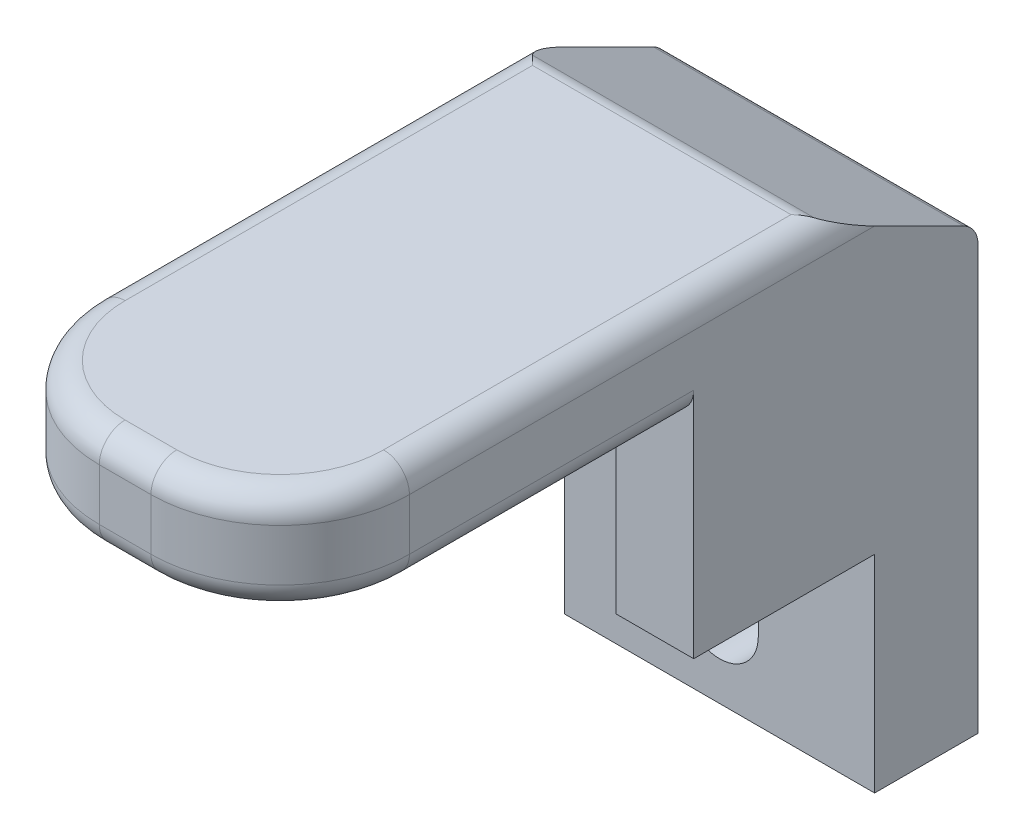
ISO-10303-21;
HEADER;
FILE_DESCRIPTION(('STEP AP214'),'2;1');
FILE_NAME('part.step','',(''),(''),'','','');
FILE_SCHEMA(('AUTOMOTIVE_DESIGN { 1 0 10303 214 1 1 1 1 }'));
ENDSEC;
DATA;
#1=APPLICATION_CONTEXT('core data for automotive mechanical design processes');
#2=APPLICATION_PROTOCOL_DEFINITION('international standard','automotive_design',2000,#1);
#3=PRODUCT_CONTEXT('',#1,'mechanical');
#4=PRODUCT('Part','Part','',(#3));
#5=PRODUCT_RELATED_PRODUCT_CATEGORY('part','',(#4));
#6=PRODUCT_DEFINITION_FORMATION('','',#4);
#7=PRODUCT_DEFINITION_CONTEXT('part definition',#1,'design');
#8=PRODUCT_DEFINITION('design','',#6,#7);
#9=PRODUCT_DEFINITION_SHAPE('','',#8);
#10=(LENGTH_UNIT() NAMED_UNIT(*) SI_UNIT(.MILLI.,.METRE.));
#11=(NAMED_UNIT(*) PLANE_ANGLE_UNIT() SI_UNIT($,.RADIAN.));
#12=(NAMED_UNIT(*) SI_UNIT($,.STERADIAN.) SOLID_ANGLE_UNIT());
#13=UNCERTAINTY_MEASURE_WITH_UNIT(LENGTH_MEASURE(1.E-05),#10,'distance_accuracy_value','');
#14=(GEOMETRIC_REPRESENTATION_CONTEXT(3) GLOBAL_UNCERTAINTY_ASSIGNED_CONTEXT((#13)) GLOBAL_UNIT_ASSIGNED_CONTEXT((#10,
#11,#12)) REPRESENTATION_CONTEXT('',''));
#15=CARTESIAN_POINT('',(0.,0.,0.));
#16=DIRECTION('',(0.,0.,1.));
#17=DIRECTION('',(1.,0.,0.));
#18=AXIS2_PLACEMENT_3D('',#15,#16,#17);
#19=CARTESIAN_POINT('',(0.,0.,4.));
#20=DIRECTION('',(0.,0.,1.));
#21=DIRECTION('',(1.,0.,0.));
#22=AXIS2_PLACEMENT_3D('',#19,#20,#21);
#23=PLANE('',#22);
#24=DIRECTION('',(-1.,0.,0.));
#25=VECTOR('',#24,1.);
#26=CARTESIAN_POINT('',(5.94978636769456,6.49974785183342,4.));
#27=LINE('',#26,#25);
#28=CARTESIAN_POINT('',(8.94978636769456,6.49974785183342,4.));
#29=VERTEX_POINT('',#28);
#30=CARTESIAN_POINT('',(5.94978636769456,6.49974785183342,4.));
#31=VERTEX_POINT('',#30);
#32=EDGE_CURVE('E309',#29,#31,#27,.T.);
#33=ORIENTED_EDGE('',*,*,#32,.F.);
#34=DIRECTION('',(0.,1.,0.));
#35=VECTOR('',#34,1.);
#36=CARTESIAN_POINT('',(8.94978636769456,6.49974785183342,4.));
#37=LINE('',#36,#35);
#38=CARTESIAN_POINT('',(8.94978636769456,2.99974785183342,4.));
#39=VERTEX_POINT('',#38);
#40=EDGE_CURVE('E307',#39,#29,#37,.T.);
#41=ORIENTED_EDGE('',*,*,#40,.F.);
#42=CARTESIAN_POINT('',(7.44978636769456,2.99974785183342,4.));
#43=DIRECTION('',(0.,0.,1.));
#44=DIRECTION('',(1.,0.,0.));
#45=AXIS2_PLACEMENT_3D('',#42,#43,#44);
#46=CIRCLE('',#45,1.5);
#47=CARTESIAN_POINT('',(5.94978636769456,2.99974785183342,4.));
#48=VERTEX_POINT('',#47);
#49=EDGE_CURVE('E315',#48,#39,#46,.T.);
#50=ORIENTED_EDGE('',*,*,#49,.F.);
#51=DIRECTION('',(0.,-1.,0.));
#52=VECTOR('',#51,1.);
#53=CARTESIAN_POINT('',(5.94978636769456,6.49974785183342,4.));
#54=LINE('',#53,#52);
#55=EDGE_CURVE('E312',#31,#48,#54,.T.);
#56=ORIENTED_EDGE('',*,*,#55,.F.);
#57=EDGE_LOOP('',(#33,#41,#50,#56));
#58=FACE_BOUND('',#57,.T.);
#59=DIRECTION('',(1.,0.,0.));
#60=VECTOR('',#59,1.);
#61=CARTESIAN_POINT('',(10.4497863676946,7.99974785183342,4.));
#62=LINE('',#61,#60);
#63=CARTESIAN_POINT('',(10.4497863676946,7.99974785183342,4.));
#64=VERTEX_POINT('',#63);
#65=CARTESIAN_POINT('',(13.4497863676946,7.99974785183342,4.));
#66=VERTEX_POINT('',#65);
#67=EDGE_CURVE('E264',#64,#66,#62,.T.);
#68=ORIENTED_EDGE('',*,*,#67,.F.);
#69=DIRECTION('',(0.,-1.,0.));
#70=VECTOR('',#69,1.);
#71=CARTESIAN_POINT('',(10.4497863676946,15.9997478518334,4.));
#72=LINE('',#71,#70);
#73=CARTESIAN_POINT('',(10.4497863676946,15.9997478518334,4.));
#74=VERTEX_POINT('',#73);
#75=EDGE_CURVE('E267',#74,#64,#72,.T.);
#76=ORIENTED_EDGE('',*,*,#75,.F.);
#77=DIRECTION('',(1.,0.,0.));
#78=VECTOR('',#77,1.);
#79=CARTESIAN_POINT('',(0.,15.9997478518334,4.));
#80=LINE('',#79,#78);
#81=CARTESIAN_POINT('',(8.94978636769456,15.9997478518334,4.));
#82=VERTEX_POINT('',#81);
#83=EDGE_CURVE('E301',#82,#74,#80,.T.);
#84=ORIENTED_EDGE('',*,*,#83,.F.);
#85=DIRECTION('',(0.,1.,0.));
#86=VECTOR('',#85,1.);
#87=CARTESIAN_POINT('',(8.94978636769456,16.9997478518334,4.));
#88=LINE('',#87,#86);
#89=CARTESIAN_POINT('',(8.94978636769456,11.9997478518334,4.));
#90=VERTEX_POINT('',#89);
#91=EDGE_CURVE('E344',#90,#82,#88,.T.);
#92=ORIENTED_EDGE('',*,*,#91,.F.);
#93=DIRECTION('',(1.,0.,0.));
#94=VECTOR('',#93,1.);
#95=CARTESIAN_POINT('',(5.94978636769456,11.9997478518334,4.));
#96=LINE('',#95,#94);
#97=CARTESIAN_POINT('',(5.94978636769456,11.9997478518334,4.));
#98=VERTEX_POINT('',#97);
#99=EDGE_CURVE('E341',#98,#90,#96,.T.);
#100=ORIENTED_EDGE('',*,*,#99,.F.);
#101=DIRECTION('',(0.,-1.,0.));
#102=VECTOR('',#101,1.);
#103=CARTESIAN_POINT('',(5.94978636769456,16.9997478518334,4.));
#104=LINE('',#103,#102);
#105=CARTESIAN_POINT('',(5.94978636769456,15.9997478518334,4.));
#106=VERTEX_POINT('',#105);
#107=EDGE_CURVE('E339',#106,#98,#104,.T.);
#108=ORIENTED_EDGE('',*,*,#107,.F.);
#109=CARTESIAN_POINT('',(4.44978636769456,15.9997478518334,4.));
#110=VERTEX_POINT('',#109);
#111=EDGE_CURVE('E305',#110,#106,#80,.T.);
#112=ORIENTED_EDGE('',*,*,#111,.F.);
#113=DIRECTION('',(0.,1.,0.));
#114=VECTOR('',#113,1.);
#115=CARTESIAN_POINT('',(4.44978636769456,15.9997478518334,4.));
#116=LINE('',#115,#114);
#117=CARTESIAN_POINT('',(4.44978636769456,7.99974785183342,4.));
#118=VERTEX_POINT('',#117);
#119=EDGE_CURVE('E271',#118,#110,#116,.T.);
#120=ORIENTED_EDGE('',*,*,#119,.F.);
#121=DIRECTION('',(1.,0.,0.));
#122=VECTOR('',#121,1.);
#123=CARTESIAN_POINT('',(1.44978636769456,7.99974785183342,4.));
#124=LINE('',#123,#122);
#125=CARTESIAN_POINT('',(1.44978636769456,7.99974785183342,4.));
#126=VERTEX_POINT('',#125);
#127=EDGE_CURVE('E268',#126,#118,#124,.T.);
#128=ORIENTED_EDGE('',*,*,#127,.F.);
#129=DIRECTION('',(0.,-1.,0.));
#130=VECTOR('',#129,1.);
#131=CARTESIAN_POINT('',(1.44978636769456,19.9997478518334,4.));
#132=LINE('',#131,#130);
#133=CARTESIAN_POINT('',(1.44978636769456,-0.000252148166584032,4.));
#134=VERTEX_POINT('',#133);
#135=EDGE_CURVE('E361',#126,#134,#132,.T.);
#136=ORIENTED_EDGE('',*,*,#135,.T.);
#137=DIRECTION('',(1.,0.,0.));
#138=VECTOR('',#137,1.);
#139=CARTESIAN_POINT('',(1.44978636769456,-0.000252148166584032,4.));
#140=LINE('',#139,#138);
#141=CARTESIAN_POINT('',(13.4497863676946,-0.000252148166584032,4.));
#142=VERTEX_POINT('',#141);
#143=EDGE_CURVE('E364',#134,#142,#140,.T.);
#144=ORIENTED_EDGE('',*,*,#143,.T.);
#145=DIRECTION('',(0.,1.,0.));
#146=VECTOR('',#145,1.);
#147=CARTESIAN_POINT('',(13.4497863676946,-0.000252148166584032,4.));
#148=LINE('',#147,#146);
#149=EDGE_CURVE('E359',#142,#66,#148,.T.);
#150=ORIENTED_EDGE('',*,*,#149,.T.);
#151=EDGE_LOOP('',(#68,#76,#84,#92,#100,#108,#112,#120,#128,#136,#144,#150));
#152=FACE_BOUND('',#151,.T.);
#153=ADVANCED_FACE('F36',(#58,#152),#23,.T.);
#154=CARTESIAN_POINT('',(1.44978636769456,15.9997478518334,-12.6491106406735));
#155=DIRECTION('',(0.,-1.,0.));
#156=DIRECTION('',(0.,0.,-1.));
#157=AXIS2_PLACEMENT_3D('',#154,#155,#156);
#158=PLANE('',#157);
#159=DIRECTION('',(-1.,0.,0.));
#160=VECTOR('',#159,1.);
#161=CARTESIAN_POINT('',(10.4497863676946,15.9997478518334,11.));
#162=LINE('',#161,#160);
#163=CARTESIAN_POINT('',(12.4497863676946,15.9997478518334,11.));
#164=VERTEX_POINT('',#163);
#165=CARTESIAN_POINT('',(10.4497863676946,15.9997478518334,11.));
#166=VERTEX_POINT('',#165);
#167=EDGE_CURVE('E260',#164,#166,#162,.T.);
#168=ORIENTED_EDGE('',*,*,#167,.F.);
#169=DIRECTION('',(0.,0.,1.));
#170=VECTOR('',#169,1.);
#171=CARTESIAN_POINT('',(12.4497863676946,15.9997478518334,22.));
#172=LINE('',#171,#170);
#173=CARTESIAN_POINT('',(12.4497863676946,15.9997478518334,22.));
#174=VERTEX_POINT('',#173);
#175=EDGE_CURVE('E442',#164,#174,#172,.T.);
#176=ORIENTED_EDGE('',*,*,#175,.T.);
#177=CARTESIAN_POINT('',(8.44978636769456,15.9997478518334,22.));
#178=DIRECTION('',(0.,-1.,0.));
#179=DIRECTION('',(0.,0.,-1.));
#180=AXIS2_PLACEMENT_3D('',#177,#178,#179);
#181=CIRCLE('',#180,4.);
#182=CARTESIAN_POINT('',(8.44978636769456,15.9997478518334,26.));
#183=VERTEX_POINT('',#182);
#184=EDGE_CURVE('E60',#174,#183,#181,.T.);
#185=ORIENTED_EDGE('',*,*,#184,.T.);
#186=DIRECTION('',(1.,0.,0.));
#187=VECTOR('',#186,1.);
#188=CARTESIAN_POINT('',(1.44978636769456,15.9997478518334,26.));
#189=LINE('',#188,#187);
#190=CARTESIAN_POINT('',(6.44978636769456,15.9997478518334,26.));
#191=VERTEX_POINT('',#190);
#192=EDGE_CURVE('E439',#183,#191,#189,.F.);
#193=ORIENTED_EDGE('',*,*,#192,.T.);
#194=CARTESIAN_POINT('',(6.44978636769456,15.9997478518334,22.));
#195=DIRECTION('',(0.,-1.,0.));
#196=DIRECTION('',(0.,0.,-1.));
#197=AXIS2_PLACEMENT_3D('',#194,#195,#196);
#198=CIRCLE('',#197,4.);
#199=CARTESIAN_POINT('',(2.44978636769456,15.9997478518334,22.));
#200=VERTEX_POINT('',#199);
#201=EDGE_CURVE('E435',#191,#200,#198,.T.);
#202=ORIENTED_EDGE('',*,*,#201,.T.);
#203=DIRECTION('',(0.,0.,1.));
#204=VECTOR('',#203,1.);
#205=CARTESIAN_POINT('',(2.44978636769456,15.9997478518334,11.));
#206=LINE('',#205,#204);
#207=CARTESIAN_POINT('',(2.44978636769456,15.9997478518334,11.));
#208=VERTEX_POINT('',#207);
#209=EDGE_CURVE('E437',#200,#208,#206,.F.);
#210=ORIENTED_EDGE('',*,*,#209,.T.);
#211=DIRECTION('',(-1.,0.,0.));
#212=VECTOR('',#211,1.);
#213=CARTESIAN_POINT('',(1.44978636769456,15.9997478518334,11.));
#214=LINE('',#213,#212);
#215=CARTESIAN_POINT('',(4.44978636769456,15.9997478518334,11.));
#216=VERTEX_POINT('',#215);
#217=EDGE_CURVE('E285',#216,#208,#214,.T.);
#218=ORIENTED_EDGE('',*,*,#217,.F.);
#219=DIRECTION('',(0.,0.,-1.));
#220=VECTOR('',#219,1.);
#221=CARTESIAN_POINT('',(4.44978636769456,15.9997478518334,11.));
#222=LINE('',#221,#220);
#223=EDGE_CURVE('E287',#216,#110,#222,.T.);
#224=ORIENTED_EDGE('',*,*,#223,.T.);
#225=ORIENTED_EDGE('',*,*,#111,.T.);
#226=DIRECTION('',(0.,0.,-1.));
#227=VECTOR('',#226,1.);
#228=CARTESIAN_POINT('',(5.94978636769456,15.9997478518334,4.));
#229=LINE('',#228,#227);
#230=CARTESIAN_POINT('',(5.94978636769456,15.9997478518334,0.));
#231=VERTEX_POINT('',#230);
#232=EDGE_CURVE('E304',#106,#231,#229,.T.);
#233=ORIENTED_EDGE('',*,*,#232,.T.);
#234=DIRECTION('',(-1.,0.,0.));
#235=VECTOR('',#234,1.);
#236=CARTESIAN_POINT('',(1.44978636769456,15.9997478518334,0.));
#237=LINE('',#236,#235);
#238=CARTESIAN_POINT('',(8.94978636769456,15.9997478518334,0.));
#239=VERTEX_POINT('',#238);
#240=EDGE_CURVE('E298',#239,#231,#237,.T.);
#241=ORIENTED_EDGE('',*,*,#240,.F.);
#242=DIRECTION('',(0.,0.,1.));
#243=VECTOR('',#242,1.);
#244=CARTESIAN_POINT('',(8.94978636769456,15.9997478518334,4.));
#245=LINE('',#244,#243);
#246=EDGE_CURVE('E377',#239,#82,#245,.T.);
#247=ORIENTED_EDGE('',*,*,#246,.T.);
#248=ORIENTED_EDGE('',*,*,#83,.T.);
#249=DIRECTION('',(0.,0.,-1.));
#250=VECTOR('',#249,1.);
#251=CARTESIAN_POINT('',(10.4497863676946,15.9997478518334,11.));
#252=LINE('',#251,#250);
#253=EDGE_CURVE('E273',#166,#74,#252,.T.);
#254=ORIENTED_EDGE('',*,*,#253,.F.);
#255=EDGE_LOOP('',(#168,#176,#185,#193,#202,#210,#218,#224,#225,#233,#241,#247,#248,#254));
#256=FACE_BOUND('',#255,.T.);
#257=ADVANCED_FACE('F488',(#256),#158,.T.);
#258=CARTESIAN_POINT('',(0.,0.,0.));
#259=DIRECTION('',(0.,0.,1.));
#260=DIRECTION('',(1.,0.,0.));
#261=AXIS2_PLACEMENT_3D('',#258,#259,#260);
#262=PLANE('',#261);
#263=ORIENTED_EDGE('',*,*,#240,.T.);
#264=DIRECTION('',(0.,-1.,0.));
#265=VECTOR('',#264,1.);
#266=CARTESIAN_POINT('',(5.94978636769456,16.9997478518334,0.));
#267=LINE('',#266,#265);
#268=CARTESIAN_POINT('',(5.94978636769456,11.9997478518334,0.));
#269=VERTEX_POINT('',#268);
#270=EDGE_CURVE('E338',#231,#269,#267,.T.);
#271=ORIENTED_EDGE('',*,*,#270,.T.);
#272=DIRECTION('',(1.,0.,0.));
#273=VECTOR('',#272,1.);
#274=CARTESIAN_POINT('',(5.94978636769456,11.9997478518334,0.));
#275=LINE('',#274,#273);
#276=CARTESIAN_POINT('',(8.94978636769456,11.9997478518334,0.));
#277=VERTEX_POINT('',#276);
#278=EDGE_CURVE('E349',#269,#277,#275,.T.);
#279=ORIENTED_EDGE('',*,*,#278,.T.);
#280=DIRECTION('',(0.,1.,0.));
#281=VECTOR('',#280,1.);
#282=CARTESIAN_POINT('',(8.94978636769456,16.9997478518334,0.));
#283=LINE('',#282,#281);
#284=EDGE_CURVE('E342',#277,#239,#283,.T.);
#285=ORIENTED_EDGE('',*,*,#284,.T.);
#286=EDGE_LOOP('',(#263,#271,#279,#285));
#287=FACE_BOUND('',#286,.T.);
#288=DIRECTION('',(0.,-1.,0.));
#289=VECTOR('',#288,1.);
#290=CARTESIAN_POINT('',(1.44978636769456,19.9997478518334,0.));
#291=LINE('',#290,#289);
#292=CARTESIAN_POINT('',(1.44978636769456,16.3817138630835,0.));
#293=VERTEX_POINT('',#292);
#294=CARTESIAN_POINT('',(1.44978636769456,-0.000252148166584032,0.));
#295=VERTEX_POINT('',#294);
#296=EDGE_CURVE('E369',#293,#295,#291,.T.);
#297=ORIENTED_EDGE('',*,*,#296,.F.);
#298=DIRECTION('',(-1.,0.,0.));
#299=VECTOR('',#298,1.);
#300=CARTESIAN_POINT('',(0.,16.3817138630835,0.));
#301=LINE('',#300,#299);
#302=CARTESIAN_POINT('',(13.4497863676946,16.3817138630835,0.));
#303=VERTEX_POINT('',#302);
#304=EDGE_CURVE('E448',#293,#303,#301,.F.);
#305=ORIENTED_EDGE('',*,*,#304,.T.);
#306=DIRECTION('',(0.,1.,0.));
#307=VECTOR('',#306,1.);
#308=CARTESIAN_POINT('',(13.4497863676946,-0.000252148166584032,0.));
#309=LINE('',#308,#307);
#310=CARTESIAN_POINT('',(13.4497863676946,-0.000252148166584032,0.));
#311=VERTEX_POINT('',#310);
#312=EDGE_CURVE('E358',#311,#303,#309,.T.);
#313=ORIENTED_EDGE('',*,*,#312,.F.);
#314=DIRECTION('',(1.,0.,0.));
#315=VECTOR('',#314,1.);
#316=CARTESIAN_POINT('',(1.44978636769456,-0.000252148166584032,0.));
#317=LINE('',#316,#315);
#318=EDGE_CURVE('E362',#295,#311,#317,.T.);
#319=ORIENTED_EDGE('',*,*,#318,.F.);
#320=EDGE_LOOP('',(#297,#305,#313,#319));
#321=FACE_BOUND('',#320,.T.);
#322=DIRECTION('',(0.,1.,0.));
#323=VECTOR('',#322,1.);
#324=CARTESIAN_POINT('',(8.94978636769456,6.49974785183342,0.));
#325=LINE('',#324,#323);
#326=CARTESIAN_POINT('',(8.94978636769456,2.99974785183342,0.));
#327=VERTEX_POINT('',#326);
#328=CARTESIAN_POINT('',(8.94978636769456,6.49974785183342,0.));
#329=VERTEX_POINT('',#328);
#330=EDGE_CURVE('E318',#327,#329,#325,.T.);
#331=ORIENTED_EDGE('',*,*,#330,.T.);
#332=DIRECTION('',(-1.,0.,0.));
#333=VECTOR('',#332,1.);
#334=CARTESIAN_POINT('',(5.94978636769456,6.49974785183342,0.));
#335=LINE('',#334,#333);
#336=CARTESIAN_POINT('',(5.94978636769456,6.49974785183342,0.));
#337=VERTEX_POINT('',#336);
#338=EDGE_CURVE('E321',#329,#337,#335,.T.);
#339=ORIENTED_EDGE('',*,*,#338,.T.);
#340=DIRECTION('',(0.,-1.,0.));
#341=VECTOR('',#340,1.);
#342=CARTESIAN_POINT('',(5.94978636769456,6.49974785183342,0.));
#343=LINE('',#342,#341);
#344=CARTESIAN_POINT('',(5.94978636769456,2.99974785183342,0.));
#345=VERTEX_POINT('',#344);
#346=EDGE_CURVE('E324',#337,#345,#343,.T.);
#347=ORIENTED_EDGE('',*,*,#346,.T.);
#348=CARTESIAN_POINT('',(7.44978636769456,2.99974785183342,0.));
#349=DIRECTION('',(0.,0.,1.));
#350=DIRECTION('',(1.,0.,0.));
#351=AXIS2_PLACEMENT_3D('',#348,#349,#350);
#352=CIRCLE('',#351,1.5);
#353=EDGE_CURVE('E310',#345,#327,#352,.T.);
#354=ORIENTED_EDGE('',*,*,#353,.T.);
#355=EDGE_LOOP('',(#331,#339,#347,#354));
#356=FACE_BOUND('',#355,.T.);
#357=ADVANCED_FACE('F512',(#287,#321,#356),#262,.F.);
#358=CARTESIAN_POINT('',(13.4497863676946,-0.000252148166584032,4.));
#359=DIRECTION('',(-1.,0.,0.));
#360=DIRECTION('',(0.,0.,1.));
#361=AXIS2_PLACEMENT_3D('',#358,#359,#360);
#362=PLANE('',#361);
#363=DIRECTION('',(0.,0.447213595499958,0.894427190999916));
#364=VECTOR('',#363,1.);
#365=CARTESIAN_POINT('',(13.4497863676946,16.9997478518334,0.));
#366=LINE('',#365,#364);
#367=CARTESIAN_POINT('',(13.4497863676946,17.2761410540834,0.552786404500044));
#368=VERTEX_POINT('',#367);
#369=CARTESIAN_POINT('',(13.4497863676946,18.9997478518334,4.));
#370=VERTEX_POINT('',#369);
#371=EDGE_CURVE('E521',#368,#370,#366,.T.);
#372=ORIENTED_EDGE('',*,*,#371,.T.);
#373=DIRECTION('',(0.,0.,-1.));
#374=VECTOR('',#373,1.);
#375=CARTESIAN_POINT('',(13.4497863676946,18.9997478518334,4.));
#376=LINE('',#375,#374);
#377=CARTESIAN_POINT('',(13.4497863676946,18.9997478518334,22.));
#378=VERTEX_POINT('',#377);
#379=EDGE_CURVE('E425',#370,#378,#376,.F.);
#380=ORIENTED_EDGE('',*,*,#379,.T.);
#381=DIRECTION('',(0.,1.,0.));
#382=VECTOR('',#381,1.);
#383=CARTESIAN_POINT('',(13.4497863676946,15.9997478518334,22.));
#384=LINE('',#383,#382);
#385=CARTESIAN_POINT('',(13.4497863676946,16.9997478518334,22.));
#386=VERTEX_POINT('',#385);
#387=EDGE_CURVE('E385',#378,#386,#384,.F.);
#388=ORIENTED_EDGE('',*,*,#387,.T.);
#389=DIRECTION('',(0.,0.,1.));
#390=VECTOR('',#389,1.);
#391=CARTESIAN_POINT('',(13.4497863676946,16.9997478518334,11.));
#392=LINE('',#391,#390);
#393=CARTESIAN_POINT('',(13.4497863676946,16.9997478518334,11.));
#394=VERTEX_POINT('',#393);
#395=EDGE_CURVE('E422',#386,#394,#392,.F.);
#396=ORIENTED_EDGE('',*,*,#395,.T.);
#397=DIRECTION('',(0.,1.,0.));
#398=VECTOR('',#397,1.);
#399=CARTESIAN_POINT('',(13.4497863676946,15.9997478518334,11.));
#400=LINE('',#399,#398);
#401=CARTESIAN_POINT('',(13.4497863676946,7.99974785183342,11.));
#402=VERTEX_POINT('',#401);
#403=EDGE_CURVE('E254',#402,#394,#400,.T.);
#404=ORIENTED_EDGE('',*,*,#403,.F.);
#405=DIRECTION('',(0.,0.,-1.));
#406=VECTOR('',#405,1.);
#407=CARTESIAN_POINT('',(13.4497863676946,7.99974785183342,11.));
#408=LINE('',#407,#406);
#409=EDGE_CURVE('E251',#402,#66,#408,.T.);
#410=ORIENTED_EDGE('',*,*,#409,.T.);
#411=ORIENTED_EDGE('',*,*,#149,.F.);
#412=DIRECTION('',(0.,0.,-1.));
#413=VECTOR('',#412,1.);
#414=CARTESIAN_POINT('',(13.4497863676946,-0.000252148166584032,4.));
#415=LINE('',#414,#413);
#416=EDGE_CURVE('E366',#142,#311,#415,.T.);
#417=ORIENTED_EDGE('',*,*,#416,.T.);
#418=ORIENTED_EDGE('',*,*,#312,.T.);
#419=CARTESIAN_POINT('',(13.4497863676946,16.3817138630835,1.));
#420=DIRECTION('',(-1.,0.,0.));
#421=DIRECTION('',(0.,0.,1.));
#422=AXIS2_PLACEMENT_3D('',#419,#420,#421);
#423=CIRCLE('',#422,1.);
#424=EDGE_CURVE('E420',#303,#368,#423,.F.);
#425=ORIENTED_EDGE('',*,*,#424,.T.);
#426=EDGE_LOOP('',(#372,#380,#388,#396,#404,#410,#411,#417,#418,#425));
#427=FACE_BOUND('',#426,.T.);
#428=ADVANCED_FACE('F530',(#427),#362,.F.);
#429=CARTESIAN_POINT('',(13.4497863676946,19.9997478518334,4.));
#430=DIRECTION('',(0.,-1.,0.));
#431=DIRECTION('',(0.,0.,-1.));
#432=AXIS2_PLACEMENT_3D('',#429,#430,#431);
#433=PLANE('',#432);
#434=DIRECTION('',(-1.,0.,0.));
#435=VECTOR('',#434,1.);
#436=CARTESIAN_POINT('',(8.44978636769456,19.9997478518334,26.));
#437=LINE('',#436,#435);
#438=CARTESIAN_POINT('',(6.44978636769456,19.9997478518334,26.));
#439=VERTEX_POINT('',#438);
#440=CARTESIAN_POINT('',(8.44978636769456,19.9997478518334,26.));
#441=VERTEX_POINT('',#440);
#442=EDGE_CURVE('E416',#439,#441,#437,.F.);
#443=ORIENTED_EDGE('',*,*,#442,.T.);
#444=CARTESIAN_POINT('',(8.44978636769456,19.9997478518334,22.));
#445=DIRECTION('',(0.,-1.,0.));
#446=DIRECTION('',(0.,0.,-1.));
#447=AXIS2_PLACEMENT_3D('',#444,#445,#446);
#448=CIRCLE('',#447,4.);
#449=CARTESIAN_POINT('',(12.4497863676946,19.9997478518334,22.));
#450=VERTEX_POINT('',#449);
#451=EDGE_CURVE('E418',#441,#450,#448,.F.);
#452=ORIENTED_EDGE('',*,*,#451,.T.);
#453=DIRECTION('',(0.,0.,-1.));
#454=VECTOR('',#453,1.);
#455=CARTESIAN_POINT('',(12.4497863676946,19.9997478518334,4.));
#456=LINE('',#455,#454);
#457=CARTESIAN_POINT('',(12.4497863676946,19.9997478518334,6.23606797749979));
#458=VERTEX_POINT('',#457);
#459=EDGE_CURVE('E409',#450,#458,#456,.T.);
#460=ORIENTED_EDGE('',*,*,#459,.T.);
#461=DIRECTION('',(-1.,0.,0.));
#462=VECTOR('',#461,1.);
#463=CARTESIAN_POINT('',(13.4497863676946,19.9997478518334,6.23606797749979));
#464=LINE('',#463,#462);
#465=CARTESIAN_POINT('',(2.44978636769456,19.9997478518334,6.23606797749979));
#466=VERTEX_POINT('',#465);
#467=EDGE_CURVE('E407',#458,#466,#464,.T.);
#468=ORIENTED_EDGE('',*,*,#467,.T.);
#469=DIRECTION('',(0.,0.,-1.));
#470=VECTOR('',#469,1.);
#471=CARTESIAN_POINT('',(2.44978636769456,19.9997478518334,4.));
#472=LINE('',#471,#470);
#473=CARTESIAN_POINT('',(2.44978636769456,19.9997478518334,22.));
#474=VERTEX_POINT('',#473);
#475=EDGE_CURVE('E411',#466,#474,#472,.F.);
#476=ORIENTED_EDGE('',*,*,#475,.T.);
#477=CARTESIAN_POINT('',(6.44978636769456,19.9997478518334,22.));
#478=DIRECTION('',(0.,-1.,0.));
#479=DIRECTION('',(0.,0.,-1.));
#480=AXIS2_PLACEMENT_3D('',#477,#478,#479);
#481=CIRCLE('',#480,4.);
#482=EDGE_CURVE('E414',#474,#439,#481,.F.);
#483=ORIENTED_EDGE('',*,*,#482,.T.);
#484=EDGE_LOOP('',(#443,#452,#460,#468,#476,#483));
#485=FACE_BOUND('',#484,.T.);
#486=ADVANCED_FACE('F590',(#485),#433,.F.);
#487=CARTESIAN_POINT('',(1.44978636769456,19.9997478518334,4.));
#488=DIRECTION('',(1.,0.,0.));
#489=DIRECTION('',(0.,1.,0.));
#490=AXIS2_PLACEMENT_3D('',#487,#488,#489);
#491=PLANE('',#490);
#492=DIRECTION('',(0.,-1.,0.));
#493=VECTOR('',#492,1.);
#494=CARTESIAN_POINT('',(1.44978636769456,19.9997478518334,22.));
#495=LINE('',#494,#493);
#496=CARTESIAN_POINT('',(1.44978636769456,16.9997478518334,22.));
#497=VERTEX_POINT('',#496);
#498=CARTESIAN_POINT('',(1.44978636769456,18.9997478518334,22.));
#499=VERTEX_POINT('',#498);
#500=EDGE_CURVE('E388',#497,#499,#495,.F.);
#501=ORIENTED_EDGE('',*,*,#500,.T.);
#502=DIRECTION('',(0.,0.,-1.));
#503=VECTOR('',#502,1.);
#504=CARTESIAN_POINT('',(1.44978636769456,18.9997478518334,4.));
#505=LINE('',#504,#503);
#506=CARTESIAN_POINT('',(1.44978636769456,18.9997478518334,4.));
#507=VERTEX_POINT('',#506);
#508=EDGE_CURVE('E395',#499,#507,#505,.T.);
#509=ORIENTED_EDGE('',*,*,#508,.T.);
#510=DIRECTION('',(0.,0.447213595499958,0.894427190999916));
#511=VECTOR('',#510,1.);
#512=CARTESIAN_POINT('',(1.44978636769456,16.9997478518334,0.));
#513=LINE('',#512,#511);
#514=CARTESIAN_POINT('',(1.44978636769456,17.2761410540834,0.552786404500044));
#515=VERTEX_POINT('',#514);
#516=EDGE_CURVE('E468',#515,#507,#513,.T.);
#517=ORIENTED_EDGE('',*,*,#516,.F.);
#518=CARTESIAN_POINT('',(1.44978636769456,16.3817138630835,1.));
#519=DIRECTION('',(1.,0.,0.));
#520=DIRECTION('',(0.,1.,0.));
#521=AXIS2_PLACEMENT_3D('',#518,#519,#520);
#522=CIRCLE('',#521,1.);
#523=EDGE_CURVE('E391',#515,#293,#522,.F.);
#524=ORIENTED_EDGE('',*,*,#523,.T.);
#525=ORIENTED_EDGE('',*,*,#296,.T.);
#526=DIRECTION('',(0.,0.,-1.));
#527=VECTOR('',#526,1.);
#528=CARTESIAN_POINT('',(1.44978636769456,-0.000252148166584032,4.));
#529=LINE('',#528,#527);
#530=EDGE_CURVE('E374',#134,#295,#529,.T.);
#531=ORIENTED_EDGE('',*,*,#530,.F.);
#532=ORIENTED_EDGE('',*,*,#135,.F.);
#533=DIRECTION('',(0.,0.,-1.));
#534=VECTOR('',#533,1.);
#535=CARTESIAN_POINT('',(1.44978636769456,7.99974785183342,11.));
#536=LINE('',#535,#534);
#537=CARTESIAN_POINT('',(1.44978636769456,7.99974785183342,11.));
#538=VERTEX_POINT('',#537);
#539=EDGE_CURVE('E295',#538,#126,#536,.T.);
#540=ORIENTED_EDGE('',*,*,#539,.F.);
#541=DIRECTION('',(0.,-1.,0.));
#542=VECTOR('',#541,1.);
#543=CARTESIAN_POINT('',(1.44978636769456,15.9997478518334,11.));
#544=LINE('',#543,#542);
#545=CARTESIAN_POINT('',(1.44978636769456,16.9997478518334,11.));
#546=VERTEX_POINT('',#545);
#547=EDGE_CURVE('E277',#546,#538,#544,.T.);
#548=ORIENTED_EDGE('',*,*,#547,.F.);
#549=DIRECTION('',(0.,0.,1.));
#550=VECTOR('',#549,1.);
#551=CARTESIAN_POINT('',(1.44978636769456,16.9997478518334,22.));
#552=LINE('',#551,#550);
#553=EDGE_CURVE('E393',#546,#497,#552,.T.);
#554=ORIENTED_EDGE('',*,*,#553,.T.);
#555=EDGE_LOOP('',(#501,#509,#517,#524,#525,#531,#532,#540,#548,#554));
#556=FACE_BOUND('',#555,.T.);
#557=ADVANCED_FACE('F576',(#556),#491,.F.);
#558=CARTESIAN_POINT('',(1.44978636769456,-0.000252148166584032,4.));
#559=DIRECTION('',(0.,1.,0.));
#560=DIRECTION('',(-1.,0.,0.));
#561=AXIS2_PLACEMENT_3D('',#558,#559,#560);
#562=PLANE('',#561);
#563=ORIENTED_EDGE('',*,*,#318,.T.);
#564=ORIENTED_EDGE('',*,*,#416,.F.);
#565=ORIENTED_EDGE('',*,*,#143,.F.);
#566=ORIENTED_EDGE('',*,*,#530,.T.);
#567=EDGE_LOOP('',(#563,#564,#565,#566));
#568=FACE_BOUND('',#567,.T.);
#569=ADVANCED_FACE('F567',(#568),#562,.F.);
#570=CARTESIAN_POINT('',(5.94978636769456,16.9997478518334,4.));
#571=DIRECTION('',(1.,0.,0.));
#572=DIRECTION('',(0.,0.,-1.));
#573=AXIS2_PLACEMENT_3D('',#570,#571,#572);
#574=PLANE('',#573);
#575=ORIENTED_EDGE('',*,*,#232,.F.);
#576=ORIENTED_EDGE('',*,*,#107,.T.);
#577=DIRECTION('',(0.,0.,-1.));
#578=VECTOR('',#577,1.);
#579=CARTESIAN_POINT('',(5.94978636769456,11.9997478518334,4.));
#580=LINE('',#579,#578);
#581=EDGE_CURVE('E355',#98,#269,#580,.T.);
#582=ORIENTED_EDGE('',*,*,#581,.T.);
#583=ORIENTED_EDGE('',*,*,#270,.F.);
#584=EDGE_LOOP('',(#575,#576,#582,#583));
#585=FACE_BOUND('',#584,.T.);
#586=ADVANCED_FACE('F504',(#585),#574,.T.);
#587=CARTESIAN_POINT('',(5.94978636769456,11.9997478518334,4.));
#588=DIRECTION('',(0.,1.,0.));
#589=DIRECTION('',(0.,0.,1.));
#590=AXIS2_PLACEMENT_3D('',#587,#588,#589);
#591=PLANE('',#590);
#592=ORIENTED_EDGE('',*,*,#278,.F.);
#593=ORIENTED_EDGE('',*,*,#581,.F.);
#594=ORIENTED_EDGE('',*,*,#99,.T.);
#595=DIRECTION('',(0.,0.,-1.));
#596=VECTOR('',#595,1.);
#597=CARTESIAN_POINT('',(8.94978636769456,11.9997478518334,4.));
#598=LINE('',#597,#596);
#599=EDGE_CURVE('E347',#90,#277,#598,.T.);
#600=ORIENTED_EDGE('',*,*,#599,.T.);
#601=EDGE_LOOP('',(#592,#593,#594,#600));
#602=FACE_BOUND('',#601,.T.);
#603=ADVANCED_FACE('F508',(#602),#591,.T.);
#604=CARTESIAN_POINT('',(8.94978636769456,16.9997478518334,4.));
#605=DIRECTION('',(-1.,0.,0.));
#606=DIRECTION('',(0.,-1.,0.));
#607=AXIS2_PLACEMENT_3D('',#604,#605,#606);
#608=PLANE('',#607);
#609=ORIENTED_EDGE('',*,*,#246,.F.);
#610=ORIENTED_EDGE('',*,*,#284,.F.);
#611=ORIENTED_EDGE('',*,*,#599,.F.);
#612=ORIENTED_EDGE('',*,*,#91,.T.);
#613=EDGE_LOOP('',(#609,#610,#611,#612));
#614=FACE_BOUND('',#613,.T.);
#615=ADVANCED_FACE('F517',(#614),#608,.T.);
#616=CARTESIAN_POINT('',(8.94978636769456,6.49974785183342,4.));
#617=DIRECTION('',(-1.,0.,0.));
#618=DIRECTION('',(0.,-1.,0.));
#619=AXIS2_PLACEMENT_3D('',#616,#617,#618);
#620=PLANE('',#619);
#621=ORIENTED_EDGE('',*,*,#330,.F.);
#622=DIRECTION('',(0.,0.,-1.));
#623=VECTOR('',#622,1.);
#624=CARTESIAN_POINT('',(8.94978636769456,2.99974785183342,4.));
#625=LINE('',#624,#623);
#626=EDGE_CURVE('E317',#39,#327,#625,.T.);
#627=ORIENTED_EDGE('',*,*,#626,.F.);
#628=ORIENTED_EDGE('',*,*,#40,.T.);
#629=DIRECTION('',(0.,0.,-1.));
#630=VECTOR('',#629,1.);
#631=CARTESIAN_POINT('',(8.94978636769456,6.49974785183342,4.));
#632=LINE('',#631,#630);
#633=EDGE_CURVE('E335',#29,#329,#632,.T.);
#634=ORIENTED_EDGE('',*,*,#633,.T.);
#635=EDGE_LOOP('',(#621,#627,#628,#634));
#636=FACE_BOUND('',#635,.T.);
#637=ADVANCED_FACE('F664',(#636),#620,.T.);
#638=CARTESIAN_POINT('',(5.94978636769456,6.49974785183342,4.));
#639=DIRECTION('',(0.,-1.,0.));
#640=DIRECTION('',(0.,0.,-1.));
#641=AXIS2_PLACEMENT_3D('',#638,#639,#640);
#642=PLANE('',#641);
#643=ORIENTED_EDGE('',*,*,#338,.F.);
#644=ORIENTED_EDGE('',*,*,#633,.F.);
#645=ORIENTED_EDGE('',*,*,#32,.T.);
#646=DIRECTION('',(0.,0.,-1.));
#647=VECTOR('',#646,1.);
#648=CARTESIAN_POINT('',(5.94978636769456,6.49974785183342,4.));
#649=LINE('',#648,#647);
#650=EDGE_CURVE('E333',#31,#337,#649,.T.);
#651=ORIENTED_EDGE('',*,*,#650,.T.);
#652=EDGE_LOOP('',(#643,#644,#645,#651));
#653=FACE_BOUND('',#652,.T.);
#654=ADVANCED_FACE('F670',(#653),#642,.T.);
#655=CARTESIAN_POINT('',(5.94978636769456,6.49974785183342,4.));
#656=DIRECTION('',(1.,0.,0.));
#657=DIRECTION('',(0.,1.,0.));
#658=AXIS2_PLACEMENT_3D('',#655,#656,#657);
#659=PLANE('',#658);
#660=ORIENTED_EDGE('',*,*,#346,.F.);
#661=ORIENTED_EDGE('',*,*,#650,.F.);
#662=ORIENTED_EDGE('',*,*,#55,.T.);
#663=DIRECTION('',(0.,0.,-1.));
#664=VECTOR('',#663,1.);
#665=CARTESIAN_POINT('',(5.94978636769456,2.99974785183342,4.));
#666=LINE('',#665,#664);
#667=EDGE_CURVE('E331',#48,#345,#666,.T.);
#668=ORIENTED_EDGE('',*,*,#667,.T.);
#669=EDGE_LOOP('',(#660,#661,#662,#668));
#670=FACE_BOUND('',#669,.T.);
#671=ADVANCED_FACE('F678',(#670),#659,.T.);
#672=CARTESIAN_POINT('',(7.44978636769456,2.99974785183342,4.));
#673=DIRECTION('',(0.,0.,-1.));
#674=DIRECTION('',(-1.,0.,0.));
#675=AXIS2_PLACEMENT_3D('',#672,#673,#674);
#676=CYLINDRICAL_SURFACE('',#675,1.5);
#677=ORIENTED_EDGE('',*,*,#353,.F.);
#678=ORIENTED_EDGE('',*,*,#667,.F.);
#679=ORIENTED_EDGE('',*,*,#49,.T.);
#680=ORIENTED_EDGE('',*,*,#626,.T.);
#681=EDGE_LOOP('',(#677,#678,#679,#680));
#682=FACE_BOUND('',#681,.T.);
#683=ADVANCED_FACE('F686',(#682),#676,.F.);
#684=CARTESIAN_POINT('',(0.,0.,27.));
#685=DIRECTION('',(0.,0.,1.));
#686=DIRECTION('',(1.,0.,0.));
#687=AXIS2_PLACEMENT_3D('',#684,#685,#686);
#688=PLANE('',#687);
#689=DIRECTION('',(0.,1.,0.));
#690=VECTOR('',#689,1.);
#691=CARTESIAN_POINT('',(8.44978636769456,19.9997478518334,27.));
#692=LINE('',#691,#690);
#693=CARTESIAN_POINT('',(8.44978636769456,16.9997478518334,27.));
#694=VERTEX_POINT('',#693);
#695=CARTESIAN_POINT('',(8.44978636769456,18.9997478518334,27.));
#696=VERTEX_POINT('',#695);
#697=EDGE_CURVE('E382',#694,#696,#692,.T.);
#698=ORIENTED_EDGE('',*,*,#697,.T.);
#699=DIRECTION('',(-1.,0.,0.));
#700=VECTOR('',#699,1.);
#701=CARTESIAN_POINT('',(6.44978636769456,18.9997478518334,27.));
#702=LINE('',#701,#700);
#703=CARTESIAN_POINT('',(6.44978636769456,18.9997478518334,27.));
#704=VERTEX_POINT('',#703);
#705=EDGE_CURVE('E433',#696,#704,#702,.T.);
#706=ORIENTED_EDGE('',*,*,#705,.T.);
#707=DIRECTION('',(0.,-1.,0.));
#708=VECTOR('',#707,1.);
#709=CARTESIAN_POINT('',(6.44978636769456,15.9997478518334,27.));
#710=LINE('',#709,#708);
#711=CARTESIAN_POINT('',(6.44978636769456,16.9997478518334,27.));
#712=VERTEX_POINT('',#711);
#713=EDGE_CURVE('E379',#704,#712,#710,.T.);
#714=ORIENTED_EDGE('',*,*,#713,.T.);
#715=DIRECTION('',(1.,0.,0.));
#716=VECTOR('',#715,1.);
#717=CARTESIAN_POINT('',(0.,16.9997478518334,27.));
#718=LINE('',#717,#716);
#719=EDGE_CURVE('E431',#712,#694,#718,.T.);
#720=ORIENTED_EDGE('',*,*,#719,.T.);
#721=EDGE_LOOP('',(#698,#706,#714,#720));
#722=FACE_BOUND('',#721,.T.);
#723=ADVANCED_FACE('F552',(#722),#688,.T.);
#724=CARTESIAN_POINT('',(1.44978636769456,7.99974785183342,11.));
#725=DIRECTION('',(0.,1.,0.));
#726=DIRECTION('',(0.,0.,1.));
#727=AXIS2_PLACEMENT_3D('',#724,#725,#726);
#728=PLANE('',#727);
#729=ORIENTED_EDGE('',*,*,#127,.T.);
#730=DIRECTION('',(0.,0.,-1.));
#731=VECTOR('',#730,1.);
#732=CARTESIAN_POINT('',(4.44978636769456,7.99974785183342,11.));
#733=LINE('',#732,#731);
#734=CARTESIAN_POINT('',(4.44978636769456,7.99974785183342,11.));
#735=VERTEX_POINT('',#734);
#736=EDGE_CURVE('E292',#735,#118,#733,.T.);
#737=ORIENTED_EDGE('',*,*,#736,.F.);
#738=DIRECTION('',(1.,0.,0.));
#739=VECTOR('',#738,1.);
#740=CARTESIAN_POINT('',(1.44978636769456,7.99974785183342,11.));
#741=LINE('',#740,#739);
#742=EDGE_CURVE('E280',#538,#735,#741,.T.);
#743=ORIENTED_EDGE('',*,*,#742,.F.);
#744=ORIENTED_EDGE('',*,*,#539,.T.);
#745=EDGE_LOOP('',(#729,#737,#743,#744));
#746=FACE_BOUND('',#745,.T.);
#747=ADVANCED_FACE('F699',(#746),#728,.F.);
#748=CARTESIAN_POINT('',(4.44978636769456,15.9997478518334,11.));
#749=DIRECTION('',(-1.,0.,0.));
#750=DIRECTION('',(0.,-1.,0.));
#751=AXIS2_PLACEMENT_3D('',#748,#749,#750);
#752=PLANE('',#751);
#753=ORIENTED_EDGE('',*,*,#119,.T.);
#754=ORIENTED_EDGE('',*,*,#223,.F.);
#755=DIRECTION('',(0.,1.,0.));
#756=VECTOR('',#755,1.);
#757=CARTESIAN_POINT('',(4.44978636769456,15.9997478518334,11.));
#758=LINE('',#757,#756);
#759=EDGE_CURVE('E282',#735,#216,#758,.T.);
#760=ORIENTED_EDGE('',*,*,#759,.F.);
#761=ORIENTED_EDGE('',*,*,#736,.T.);
#762=EDGE_LOOP('',(#753,#754,#760,#761));
#763=FACE_BOUND('',#762,.T.);
#764=ADVANCED_FACE('F495',(#763),#752,.F.);
#765=CARTESIAN_POINT('',(0.,0.,11.));
#766=DIRECTION('',(0.,0.,1.));
#767=DIRECTION('',(1.,0.,0.));
#768=AXIS2_PLACEMENT_3D('',#765,#766,#767);
#769=PLANE('',#768);
#770=ORIENTED_EDGE('',*,*,#547,.T.);
#771=ORIENTED_EDGE('',*,*,#742,.T.);
#772=ORIENTED_EDGE('',*,*,#759,.T.);
#773=ORIENTED_EDGE('',*,*,#217,.T.);
#774=CARTESIAN_POINT('',(2.44978636769456,16.9997478518334,11.));
#775=DIRECTION('',(0.,0.,1.));
#776=DIRECTION('',(1.,0.,0.));
#777=AXIS2_PLACEMENT_3D('',#774,#775,#776);
#778=CIRCLE('',#777,1.);
#779=EDGE_CURVE('E12',#208,#546,#778,.F.);
#780=ORIENTED_EDGE('',*,*,#779,.T.);
#781=EDGE_LOOP('',(#770,#771,#772,#773,#780));
#782=FACE_BOUND('',#781,.T.);
#783=ADVANCED_FACE('F490',(#782),#769,.T.);
#784=CARTESIAN_POINT('',(10.4497863676946,15.9997478518334,11.));
#785=DIRECTION('',(1.,0.,0.));
#786=DIRECTION('',(0.,1.,0.));
#787=AXIS2_PLACEMENT_3D('',#784,#785,#786);
#788=PLANE('',#787);
#789=ORIENTED_EDGE('',*,*,#75,.T.);
#790=DIRECTION('',(0.,0.,-1.));
#791=VECTOR('',#790,1.);
#792=CARTESIAN_POINT('',(10.4497863676946,7.99974785183342,11.));
#793=LINE('',#792,#791);
#794=CARTESIAN_POINT('',(10.4497863676946,7.99974785183342,11.));
#795=VERTEX_POINT('',#794);
#796=EDGE_CURVE('E248',#795,#64,#793,.T.);
#797=ORIENTED_EDGE('',*,*,#796,.F.);
#798=DIRECTION('',(0.,-1.,0.));
#799=VECTOR('',#798,1.);
#800=CARTESIAN_POINT('',(10.4497863676946,15.9997478518334,11.));
#801=LINE('',#800,#799);
#802=EDGE_CURVE('E255',#166,#795,#801,.T.);
#803=ORIENTED_EDGE('',*,*,#802,.F.);
#804=ORIENTED_EDGE('',*,*,#253,.T.);
#805=EDGE_LOOP('',(#789,#797,#803,#804));
#806=FACE_BOUND('',#805,.T.);
#807=ADVANCED_FACE('F266',(#806),#788,.F.);
#808=CARTESIAN_POINT('',(10.4497863676946,7.99974785183342,11.));
#809=DIRECTION('',(0.,1.,0.));
#810=DIRECTION('',(0.,0.,1.));
#811=AXIS2_PLACEMENT_3D('',#808,#809,#810);
#812=PLANE('',#811);
#813=ORIENTED_EDGE('',*,*,#67,.T.);
#814=ORIENTED_EDGE('',*,*,#409,.F.);
#815=DIRECTION('',(1.,0.,0.));
#816=VECTOR('',#815,1.);
#817=CARTESIAN_POINT('',(10.4497863676946,7.99974785183342,11.));
#818=LINE('',#817,#816);
#819=EDGE_CURVE('E243',#795,#402,#818,.T.);
#820=ORIENTED_EDGE('',*,*,#819,.F.);
#821=ORIENTED_EDGE('',*,*,#796,.T.);
#822=EDGE_LOOP('',(#813,#814,#820,#821));
#823=FACE_BOUND('',#822,.T.);
#824=ADVANCED_FACE('F246',(#823),#812,.F.);
#825=CARTESIAN_POINT('',(0.,0.,11.));
#826=DIRECTION('',(0.,0.,1.));
#827=DIRECTION('',(1.,0.,0.));
#828=AXIS2_PLACEMENT_3D('',#825,#826,#827);
#829=PLANE('',#828);
#830=ORIENTED_EDGE('',*,*,#802,.T.);
#831=ORIENTED_EDGE('',*,*,#819,.T.);
#832=ORIENTED_EDGE('',*,*,#403,.T.);
#833=CARTESIAN_POINT('',(12.4497863676946,16.9997478518334,11.));
#834=DIRECTION('',(0.,0.,1.));
#835=DIRECTION('',(1.,0.,0.));
#836=AXIS2_PLACEMENT_3D('',#833,#834,#835);
#837=CIRCLE('',#836,1.);
#838=EDGE_CURVE('E45',#394,#164,#837,.F.);
#839=ORIENTED_EDGE('',*,*,#838,.T.);
#840=ORIENTED_EDGE('',*,*,#167,.T.);
#841=EDGE_LOOP('',(#830,#831,#832,#839,#840));
#842=FACE_BOUND('',#841,.T.);
#843=ADVANCED_FACE('F258',(#842),#829,.T.);
#844=CARTESIAN_POINT('',(8.44978636769456,0.,22.));
#845=DIRECTION('',(0.,-1.,0.));
#846=DIRECTION('',(0.,0.,-1.));
#847=AXIS2_PLACEMENT_3D('',#844,#845,#846);
#848=CYLINDRICAL_SURFACE('',#847,5.);
#849=ORIENTED_EDGE('',*,*,#387,.F.);
#850=CARTESIAN_POINT('',(8.44978636769456,18.9997478518334,22.));
#851=DIRECTION('',(0.,-1.,0.));
#852=DIRECTION('',(0.,0.,-1.));
#853=AXIS2_PLACEMENT_3D('',#850,#851,#852);
#854=CIRCLE('',#853,5.);
#855=EDGE_CURVE('E429',#378,#696,#854,.T.);
#856=ORIENTED_EDGE('',*,*,#855,.T.);
#857=ORIENTED_EDGE('',*,*,#697,.F.);
#858=CARTESIAN_POINT('',(8.44978636769456,16.9997478518334,22.));
#859=DIRECTION('',(0.,-1.,0.));
#860=DIRECTION('',(0.,0.,-1.));
#861=AXIS2_PLACEMENT_3D('',#858,#859,#860);
#862=CIRCLE('',#861,5.);
#863=EDGE_CURVE('E427',#694,#386,#862,.F.);
#864=ORIENTED_EDGE('',*,*,#863,.T.);
#865=EDGE_LOOP('',(#849,#856,#857,#864));
#866=FACE_BOUND('',#865,.T.);
#867=ADVANCED_FACE('F549',(#866),#848,.T.);
#868=CARTESIAN_POINT('',(6.44978636769456,0.,22.));
#869=DIRECTION('',(0.,1.,0.));
#870=DIRECTION('',(-1.,0.,0.));
#871=AXIS2_PLACEMENT_3D('',#868,#869,#870);
#872=CYLINDRICAL_SURFACE('',#871,5.);
#873=ORIENTED_EDGE('',*,*,#713,.F.);
#874=CARTESIAN_POINT('',(6.44978636769456,18.9997478518334,22.));
#875=DIRECTION('',(0.,-1.,0.));
#876=DIRECTION('',(0.,0.,-1.));
#877=AXIS2_PLACEMENT_3D('',#874,#875,#876);
#878=CIRCLE('',#877,5.);
#879=EDGE_CURVE('E446',#704,#499,#878,.T.);
#880=ORIENTED_EDGE('',*,*,#879,.T.);
#881=ORIENTED_EDGE('',*,*,#500,.F.);
#882=CARTESIAN_POINT('',(6.44978636769456,16.9997478518334,22.));
#883=DIRECTION('',(0.,-1.,0.));
#884=DIRECTION('',(0.,0.,-1.));
#885=AXIS2_PLACEMENT_3D('',#882,#883,#884);
#886=CIRCLE('',#885,5.);
#887=EDGE_CURVE('E444',#497,#712,#886,.F.);
#888=ORIENTED_EDGE('',*,*,#887,.T.);
#889=EDGE_LOOP('',(#873,#880,#881,#888));
#890=FACE_BOUND('',#889,.T.);
#891=ADVANCED_FACE('F599',(#890),#872,.T.);
#892=CARTESIAN_POINT('',(13.4497863676946,16.9997478518334,0.));
#893=DIRECTION('',(0.,-0.894427190999916,0.447213595499958));
#894=DIRECTION('',(0.,-0.447213595499958,-0.894427190999916));
#895=AXIS2_PLACEMENT_3D('',#892,#893,#894);
#896=PLANE('',#895);
#897=ORIENTED_EDGE('',*,*,#516,.T.);
#898=CARTESIAN_POINT('',(2.44978636769456,18.9997478518334,4.));
#899=DIRECTION('',(0.,-0.894427190999916,0.447213595499958));
#900=DIRECTION('',(0.,-0.447213595499958,-0.894427190999916));
#901=AXIS2_PLACEMENT_3D('',#898,#899,#900);
#902=ELLIPSE('',#901,2.23606797749979,1.);
#903=CARTESIAN_POINT('',(2.0025727721946,19.8941750428333,5.78885438199983));
#904=VERTEX_POINT('',#903);
#905=EDGE_CURVE('E405',#507,#904,#902,.F.);
#906=ORIENTED_EDGE('',*,*,#905,.T.);
#907=DIRECTION('',(-1.,0.,0.));
#908=VECTOR('',#907,1.);
#909=CARTESIAN_POINT('',(13.4497863676946,19.8941750428333,5.78885438199983));
#910=LINE('',#909,#908);
#911=CARTESIAN_POINT('',(12.8969999631945,19.8941750428333,5.78885438199983));
#912=VERTEX_POINT('',#911);
#913=EDGE_CURVE('E401',#904,#912,#910,.F.);
#914=ORIENTED_EDGE('',*,*,#913,.T.);
#915=CARTESIAN_POINT('',(12.4497863676946,18.9997478518334,4.));
#916=DIRECTION('',(0.,-0.894427190999916,0.447213595499958));
#917=DIRECTION('',(0.,-0.447213595499958,-0.894427190999916));
#918=AXIS2_PLACEMENT_3D('',#915,#916,#917);
#919=ELLIPSE('',#918,2.23606797749979,1.);
#920=EDGE_CURVE('E403',#912,#370,#919,.F.);
#921=ORIENTED_EDGE('',*,*,#920,.T.);
#922=ORIENTED_EDGE('',*,*,#371,.F.);
#923=DIRECTION('',(-1.,0.,0.));
#924=VECTOR('',#923,1.);
#925=CARTESIAN_POINT('',(13.4497863676946,17.2761410540834,0.552786404500043));
#926=LINE('',#925,#924);
#927=EDGE_CURVE('E398',#368,#515,#926,.T.);
#928=ORIENTED_EDGE('',*,*,#927,.T.);
#929=EDGE_LOOP('',(#897,#906,#914,#921,#922,#928));
#930=FACE_BOUND('',#929,.T.);
#931=ADVANCED_FACE('F574',(#930),#896,.F.);
#932=CARTESIAN_POINT('',(8.44978636769456,18.9997478518334,22.));
#933=DIRECTION('',(0.,-1.,0.));
#934=DIRECTION('',(0.,0.,-1.));
#935=AXIS2_PLACEMENT_3D('',#932,#933,#934);
#936=TOROIDAL_SURFACE('',#935,4.,1.);
#937=CARTESIAN_POINT('',(12.4497863676946,18.9997478518334,22.));
#938=DIRECTION('',(0.,0.,-1.));
#939=DIRECTION('',(-1.,0.,0.));
#940=AXIS2_PLACEMENT_3D('',#937,#938,#939);
#941=CIRCLE('',#940,1.);
#942=EDGE_CURVE('E462',#450,#378,#941,.T.);
#943=ORIENTED_EDGE('',*,*,#942,.F.);
#944=ORIENTED_EDGE('',*,*,#451,.F.);
#945=CARTESIAN_POINT('',(8.44978636769456,18.9997478518334,26.));
#946=DIRECTION('',(-1.,0.,0.));
#947=DIRECTION('',(0.,0.,1.));
#948=AXIS2_PLACEMENT_3D('',#945,#946,#947);
#949=CIRCLE('',#948,1.);
#950=EDGE_CURVE('E465',#696,#441,#949,.T.);
#951=ORIENTED_EDGE('',*,*,#950,.F.);
#952=ORIENTED_EDGE('',*,*,#855,.F.);
#953=EDGE_LOOP('',(#943,#944,#951,#952));
#954=FACE_BOUND('',#953,.T.);
#955=ADVANCED_FACE('F544',(#954),#936,.T.);
#956=CARTESIAN_POINT('',(0.,18.9997478518334,26.));
#957=DIRECTION('',(1.,0.,0.));
#958=DIRECTION('',(0.,0.,-1.));
#959=AXIS2_PLACEMENT_3D('',#956,#957,#958);
#960=CYLINDRICAL_SURFACE('',#959,1.);
#961=ORIENTED_EDGE('',*,*,#950,.T.);
#962=ORIENTED_EDGE('',*,*,#442,.F.);
#963=CARTESIAN_POINT('',(6.44978636769456,18.9997478518334,26.));
#964=DIRECTION('',(-1.,0.,0.));
#965=DIRECTION('',(0.,0.,1.));
#966=AXIS2_PLACEMENT_3D('',#963,#964,#965);
#967=CIRCLE('',#966,1.);
#968=EDGE_CURVE('E459',#704,#439,#967,.T.);
#969=ORIENTED_EDGE('',*,*,#968,.F.);
#970=ORIENTED_EDGE('',*,*,#705,.F.);
#971=EDGE_LOOP('',(#961,#962,#969,#970));
#972=FACE_BOUND('',#971,.T.);
#973=ADVANCED_FACE('F594',(#972),#960,.T.);
#974=CARTESIAN_POINT('',(12.4497863676946,18.9997478518334,4.));
#975=DIRECTION('',(0.,0.,-1.));
#976=DIRECTION('',(-1.,0.,0.));
#977=AXIS2_PLACEMENT_3D('',#974,#975,#976);
#978=CYLINDRICAL_SURFACE('',#977,1.);
#979=ORIENTED_EDGE('',*,*,#379,.F.);
#980=ORIENTED_EDGE('',*,*,#920,.F.);
#981=CARTESIAN_POINT('',(12.4497863676946,18.9997478518334,6.23606797749979));
#982=DIRECTION('',(-0.707106781186548,0.,-0.707106781186547));
#983=DIRECTION('',(-0.707106781186547,0.,0.707106781186548));
#984=AXIS2_PLACEMENT_3D('',#981,#982,#983);
#985=ELLIPSE('',#984,1.4142135623731,1.);
#986=EDGE_CURVE('E456',#458,#912,#985,.T.);
#987=ORIENTED_EDGE('',*,*,#986,.F.);
#988=ORIENTED_EDGE('',*,*,#459,.F.);
#989=ORIENTED_EDGE('',*,*,#942,.T.);
#990=EDGE_LOOP('',(#979,#980,#987,#988,#989));
#991=FACE_BOUND('',#990,.T.);
#992=ADVANCED_FACE('F537',(#991),#978,.T.);
#993=CARTESIAN_POINT('',(6.44978636769456,18.9997478518334,22.));
#994=DIRECTION('',(0.,-1.,0.));
#995=DIRECTION('',(0.,0.,-1.));
#996=AXIS2_PLACEMENT_3D('',#993,#994,#995);
#997=TOROIDAL_SURFACE('',#996,4.,1.);
#998=ORIENTED_EDGE('',*,*,#968,.T.);
#999=ORIENTED_EDGE('',*,*,#482,.F.);
#1000=CARTESIAN_POINT('',(2.44978636769456,18.9997478518334,22.));
#1001=DIRECTION('',(0.,0.,-1.));
#1002=DIRECTION('',(-1.,0.,0.));
#1003=AXIS2_PLACEMENT_3D('',#1000,#1001,#1002);
#1004=CIRCLE('',#1003,1.);
#1005=EDGE_CURVE('E454',#499,#474,#1004,.T.);
#1006=ORIENTED_EDGE('',*,*,#1005,.F.);
#1007=ORIENTED_EDGE('',*,*,#879,.F.);
#1008=EDGE_LOOP('',(#998,#999,#1006,#1007));
#1009=FACE_BOUND('',#1008,.T.);
#1010=ADVANCED_FACE('F597',(#1009),#997,.T.);
#1011=CARTESIAN_POINT('',(13.4497863676946,18.9997478518334,6.23606797749979));
#1012=DIRECTION('',(-1.,0.,0.));
#1013=DIRECTION('',(0.,0.,1.));
#1014=AXIS2_PLACEMENT_3D('',#1011,#1012,#1013);
#1015=CYLINDRICAL_SURFACE('',#1014,1.);
#1016=ORIENTED_EDGE('',*,*,#986,.T.);
#1017=ORIENTED_EDGE('',*,*,#913,.F.);
#1018=CARTESIAN_POINT('',(2.44978636769456,18.9997478518334,6.23606797749979));
#1019=DIRECTION('',(-0.707106781186547,0.,0.707106781186548));
#1020=DIRECTION('',(-0.707106781186548,0.,-0.707106781186547));
#1021=AXIS2_PLACEMENT_3D('',#1018,#1019,#1020);
#1022=ELLIPSE('',#1021,1.41421356237309,1.);
#1023=EDGE_CURVE('E451',#466,#904,#1022,.T.);
#1024=ORIENTED_EDGE('',*,*,#1023,.F.);
#1025=ORIENTED_EDGE('',*,*,#467,.F.);
#1026=EDGE_LOOP('',(#1016,#1017,#1024,#1025));
#1027=FACE_BOUND('',#1026,.T.);
#1028=ADVANCED_FACE('F587',(#1027),#1015,.T.);
#1029=CARTESIAN_POINT('',(2.44978636769456,18.9997478518334,4.));
#1030=DIRECTION('',(0.,0.,-1.));
#1031=DIRECTION('',(-1.,0.,0.));
#1032=AXIS2_PLACEMENT_3D('',#1029,#1030,#1031);
#1033=CYLINDRICAL_SURFACE('',#1032,1.);
#1034=ORIENTED_EDGE('',*,*,#1005,.T.);
#1035=ORIENTED_EDGE('',*,*,#475,.F.);
#1036=ORIENTED_EDGE('',*,*,#1023,.T.);
#1037=ORIENTED_EDGE('',*,*,#905,.F.);
#1038=ORIENTED_EDGE('',*,*,#508,.F.);
#1039=EDGE_LOOP('',(#1034,#1035,#1036,#1037,#1038));
#1040=FACE_BOUND('',#1039,.T.);
#1041=ADVANCED_FACE('F581',(#1040),#1033,.T.);
#1042=CARTESIAN_POINT('',(2.44978636769456,16.9997478518334,4.));
#1043=DIRECTION('',(0.,0.,-1.));
#1044=DIRECTION('',(-1.,0.,0.));
#1045=AXIS2_PLACEMENT_3D('',#1042,#1043,#1044);
#1046=CYLINDRICAL_SURFACE('',#1045,1.);
#1047=ORIENTED_EDGE('',*,*,#779,.F.);
#1048=ORIENTED_EDGE('',*,*,#209,.F.);
#1049=CARTESIAN_POINT('',(2.44978636769456,16.9997478518334,22.));
#1050=DIRECTION('',(0.,0.,1.));
#1051=DIRECTION('',(1.,0.,0.));
#1052=AXIS2_PLACEMENT_3D('',#1049,#1050,#1051);
#1053=CIRCLE('',#1052,1.);
#1054=EDGE_CURVE('E40',#497,#200,#1053,.T.);
#1055=ORIENTED_EDGE('',*,*,#1054,.F.);
#1056=ORIENTED_EDGE('',*,*,#553,.F.);
#1057=EDGE_LOOP('',(#1047,#1048,#1055,#1056));
#1058=FACE_BOUND('',#1057,.T.);
#1059=ADVANCED_FACE('F487',(#1058),#1046,.T.);
#1060=CARTESIAN_POINT('',(6.44978636769456,16.9997478518334,22.));
#1061=DIRECTION('',(0.,-1.,0.));
#1062=DIRECTION('',(0.,0.,-1.));
#1063=AXIS2_PLACEMENT_3D('',#1060,#1061,#1062);
#1064=TOROIDAL_SURFACE('',#1063,4.,1.);
#1065=ORIENTED_EDGE('',*,*,#1054,.T.);
#1066=ORIENTED_EDGE('',*,*,#201,.F.);
#1067=CARTESIAN_POINT('',(6.44978636769456,16.9997478518334,26.));
#1068=DIRECTION('',(1.,0.,0.));
#1069=DIRECTION('',(0.,0.,-1.));
#1070=AXIS2_PLACEMENT_3D('',#1067,#1068,#1069);
#1071=CIRCLE('',#1070,1.);
#1072=EDGE_CURVE('E472',#712,#191,#1071,.T.);
#1073=ORIENTED_EDGE('',*,*,#1072,.F.);
#1074=ORIENTED_EDGE('',*,*,#887,.F.);
#1075=EDGE_LOOP('',(#1065,#1066,#1073,#1074));
#1076=FACE_BOUND('',#1075,.T.);
#1077=ADVANCED_FACE('F482',(#1076),#1064,.T.);
#1078=CARTESIAN_POINT('',(0.,16.9997478518334,26.));
#1079=DIRECTION('',(1.,0.,0.));
#1080=DIRECTION('',(0.,0.,-1.));
#1081=AXIS2_PLACEMENT_3D('',#1078,#1079,#1080);
#1082=CYLINDRICAL_SURFACE('',#1081,1.);
#1083=ORIENTED_EDGE('',*,*,#1072,.T.);
#1084=ORIENTED_EDGE('',*,*,#192,.F.);
#1085=CARTESIAN_POINT('',(8.44978636769456,16.9997478518334,26.));
#1086=DIRECTION('',(1.,0.,0.));
#1087=DIRECTION('',(0.,0.,-1.));
#1088=AXIS2_PLACEMENT_3D('',#1085,#1086,#1087);
#1089=CIRCLE('',#1088,1.);
#1090=EDGE_CURVE('E470',#694,#183,#1089,.T.);
#1091=ORIENTED_EDGE('',*,*,#1090,.F.);
#1092=ORIENTED_EDGE('',*,*,#719,.F.);
#1093=EDGE_LOOP('',(#1083,#1084,#1091,#1092));
#1094=FACE_BOUND('',#1093,.T.);
#1095=ADVANCED_FACE('F554',(#1094),#1082,.T.);
#1096=CARTESIAN_POINT('',(8.44978636769456,16.9997478518334,22.));
#1097=DIRECTION('',(0.,-1.,0.));
#1098=DIRECTION('',(0.,0.,-1.));
#1099=AXIS2_PLACEMENT_3D('',#1096,#1097,#1098);
#1100=TOROIDAL_SURFACE('',#1099,4.,1.);
#1101=ORIENTED_EDGE('',*,*,#1090,.T.);
#1102=ORIENTED_EDGE('',*,*,#184,.F.);
#1103=CARTESIAN_POINT('',(12.4497863676946,16.9997478518334,22.));
#1104=DIRECTION('',(0.,0.,-1.));
#1105=DIRECTION('',(-1.,0.,0.));
#1106=AXIS2_PLACEMENT_3D('',#1103,#1104,#1105);
#1107=CIRCLE('',#1106,1.);
#1108=EDGE_CURVE('E53',#386,#174,#1107,.T.);
#1109=ORIENTED_EDGE('',*,*,#1108,.F.);
#1110=ORIENTED_EDGE('',*,*,#863,.F.);
#1111=EDGE_LOOP('',(#1101,#1102,#1109,#1110));
#1112=FACE_BOUND('',#1111,.T.);
#1113=ADVANCED_FACE('F557',(#1112),#1100,.T.);
#1114=CARTESIAN_POINT('',(12.4497863676946,16.9997478518334,-12.6491106406735));
#1115=DIRECTION('',(0.,0.,-1.));
#1116=DIRECTION('',(-1.,0.,0.));
#1117=AXIS2_PLACEMENT_3D('',#1114,#1115,#1116);
#1118=CYLINDRICAL_SURFACE('',#1117,1.);
#1119=ORIENTED_EDGE('',*,*,#838,.F.);
#1120=ORIENTED_EDGE('',*,*,#395,.F.);
#1121=ORIENTED_EDGE('',*,*,#1108,.T.);
#1122=ORIENTED_EDGE('',*,*,#175,.F.);
#1123=EDGE_LOOP('',(#1119,#1120,#1121,#1122));
#1124=FACE_BOUND('',#1123,.T.);
#1125=ADVANCED_FACE('F559',(#1124),#1118,.T.);
#1126=CARTESIAN_POINT('',(13.4497863676946,16.3817138630835,1.));
#1127=DIRECTION('',(-1.,0.,0.));
#1128=DIRECTION('',(0.,-1.,0.));
#1129=AXIS2_PLACEMENT_3D('',#1126,#1127,#1128);
#1130=CYLINDRICAL_SURFACE('',#1129,1.);
#1131=ORIENTED_EDGE('',*,*,#424,.F.);
#1132=ORIENTED_EDGE('',*,*,#304,.F.);
#1133=ORIENTED_EDGE('',*,*,#523,.F.);
#1134=ORIENTED_EDGE('',*,*,#927,.F.);
#1135=EDGE_LOOP('',(#1131,#1132,#1133,#1134));
#1136=FACE_BOUND('',#1135,.T.);
#1137=ADVANCED_FACE('F38',(#1136),#1130,.T.);
#1138=CLOSED_SHELL('',(#153,#257,#357,#428,#486,#557,#569,#586,#603,#615,#637,#654,#671,#683,
#723,#747,#764,#783,#807,#824,#843,#867,#891,#931,#955,#973,#992,#1010,#1028,#1041,#1059,#1077,
#1095,#1113,#1125,#1137));
#1139=MANIFOLD_SOLID_BREP('B2',#1138);
#1140=ADVANCED_BREP_SHAPE_REPRESENTATION('',(#18,#1139),#14);
#1141=SHAPE_DEFINITION_REPRESENTATION(#9,#1140);
ENDSEC;
END-ISO-10303-21;
